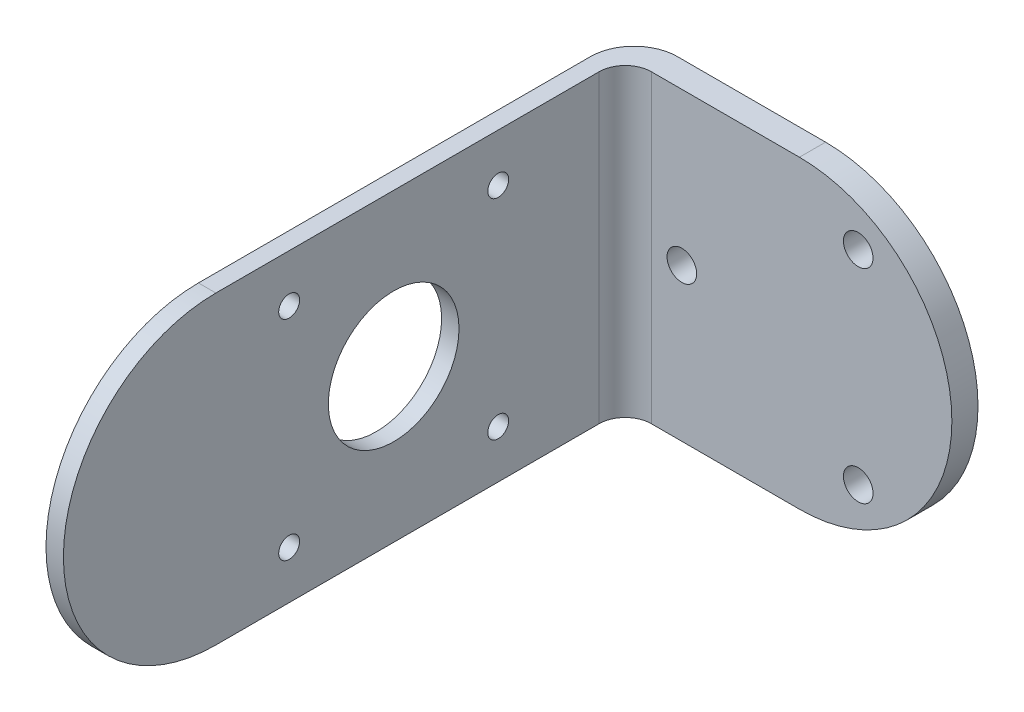
ISO-10303-21;
HEADER;
FILE_DESCRIPTION(('STEP AP214'),'2;1');
FILE_NAME('part.step','',(''),(''),'','','');
FILE_SCHEMA(('AUTOMOTIVE_DESIGN { 1 0 10303 214 1 1 1 1 }'));
ENDSEC;
DATA;
#1=APPLICATION_CONTEXT('core data for automotive mechanical design processes');
#2=APPLICATION_PROTOCOL_DEFINITION('international standard','automotive_design',2000,#1);
#3=PRODUCT_CONTEXT('',#1,'mechanical');
#4=PRODUCT('Part','Part','',(#3));
#5=PRODUCT_RELATED_PRODUCT_CATEGORY('part','',(#4));
#6=PRODUCT_DEFINITION_FORMATION('','',#4);
#7=PRODUCT_DEFINITION_CONTEXT('part definition',#1,'design');
#8=PRODUCT_DEFINITION('design','',#6,#7);
#9=PRODUCT_DEFINITION_SHAPE('','',#8);
#10=(LENGTH_UNIT() NAMED_UNIT(*) SI_UNIT(.MILLI.,.METRE.));
#11=(NAMED_UNIT(*) PLANE_ANGLE_UNIT() SI_UNIT($,.RADIAN.));
#12=(NAMED_UNIT(*) SI_UNIT($,.STERADIAN.) SOLID_ANGLE_UNIT());
#13=UNCERTAINTY_MEASURE_WITH_UNIT(LENGTH_MEASURE(1.E-05),#10,'distance_accuracy_value','');
#14=(GEOMETRIC_REPRESENTATION_CONTEXT(3) GLOBAL_UNCERTAINTY_ASSIGNED_CONTEXT((#13)) GLOBAL_UNIT_ASSIGNED_CONTEXT((#10,
#11,#12)) REPRESENTATION_CONTEXT('',''));
#15=CARTESIAN_POINT('',(0.,0.,0.));
#16=DIRECTION('',(0.,0.,1.));
#17=DIRECTION('',(1.,0.,0.));
#18=AXIS2_PLACEMENT_3D('',#15,#16,#17);
#19=CARTESIAN_POINT('',(0.,0.,3.));
#20=DIRECTION('',(0.,0.,1.));
#21=DIRECTION('',(1.,0.,0.));
#22=AXIS2_PLACEMENT_3D('',#19,#20,#21);
#23=PLANE('',#22);
#24=CARTESIAN_POINT('',(6.74999999999999,11.6913429510899,3.));
#25=DIRECTION('',(0.,0.,1.));
#26=DIRECTION('',(1.,0.,0.));
#27=AXIS2_PLACEMENT_3D('',#24,#25,#26);
#28=CIRCLE('',#27,1.7);
#29=CARTESIAN_POINT('',(8.44999999999999,11.6913429510899,3.));
#30=VERTEX_POINT('',#29);
#31=EDGE_CURVE('E165',#30,#30,#28,.T.);
#32=ORIENTED_EDGE('',*,*,#31,.F.);
#33=EDGE_LOOP('',(#32));
#34=FACE_BOUND('',#33,.T.);
#35=DIRECTION('',(-1.,0.,0.));
#36=VECTOR('',#35,1.);
#37=CARTESIAN_POINT('',(0.,17.5,3.));
#38=LINE('',#37,#36);
#39=CARTESIAN_POINT('',(0.,17.5,3.));
#40=VERTEX_POINT('',#39);
#41=CARTESIAN_POINT('',(-17.,17.5,3.));
#42=VERTEX_POINT('',#41);
#43=EDGE_CURVE('E185',#40,#42,#38,.T.);
#44=ORIENTED_EDGE('',*,*,#43,.T.);
#45=DIRECTION('',(0.,-1.,0.));
#46=VECTOR('',#45,1.);
#47=CARTESIAN_POINT('',(-17.,0.,3.));
#48=LINE('',#47,#46);
#49=CARTESIAN_POINT('',(-17.,-17.5,3.));
#50=VERTEX_POINT('',#49);
#51=EDGE_CURVE('E220',#42,#50,#48,.T.);
#52=ORIENTED_EDGE('',*,*,#51,.T.);
#53=DIRECTION('',(1.,0.,0.));
#54=VECTOR('',#53,1.);
#55=CARTESIAN_POINT('',(-20.,-17.5,3.));
#56=LINE('',#55,#54);
#57=CARTESIAN_POINT('',(0.,-17.5,3.));
#58=VERTEX_POINT('',#57);
#59=EDGE_CURVE('E189',#50,#58,#56,.T.);
#60=ORIENTED_EDGE('',*,*,#59,.T.);
#61=CARTESIAN_POINT('',(0.,0.,3.));
#62=DIRECTION('',(0.,0.,1.));
#63=DIRECTION('',(1.,0.,0.));
#64=AXIS2_PLACEMENT_3D('',#61,#62,#63);
#65=CIRCLE('',#64,17.5);
#66=EDGE_CURVE('E181',#58,#40,#65,.T.);
#67=ORIENTED_EDGE('',*,*,#66,.T.);
#68=EDGE_LOOP('',(#44,#52,#60,#67));
#69=FACE_BOUND('',#68,.T.);
#70=CARTESIAN_POINT('',(-13.5,0.,3.));
#71=DIRECTION('',(0.,0.,1.));
#72=DIRECTION('',(1.,0.,0.));
#73=AXIS2_PLACEMENT_3D('',#70,#71,#72);
#74=CIRCLE('',#73,1.7);
#75=CARTESIAN_POINT('',(-11.8,0.,3.));
#76=VERTEX_POINT('',#75);
#77=EDGE_CURVE('E173',#76,#76,#74,.T.);
#78=ORIENTED_EDGE('',*,*,#77,.F.);
#79=EDGE_LOOP('',(#78));
#80=FACE_BOUND('',#79,.T.);
#81=CARTESIAN_POINT('',(6.75000000000015,-11.6913429510898,3.));
#82=DIRECTION('',(0.,0.,1.));
#83=DIRECTION('',(1.,0.,0.));
#84=AXIS2_PLACEMENT_3D('',#81,#82,#83);
#85=CIRCLE('',#84,1.7);
#86=CARTESIAN_POINT('',(8.45000000000015,-11.6913429510898,3.));
#87=VERTEX_POINT('',#86);
#88=EDGE_CURVE('E157',#87,#87,#85,.T.);
#89=ORIENTED_EDGE('',*,*,#88,.F.);
#90=EDGE_LOOP('',(#89));
#91=FACE_BOUND('',#90,.T.);
#92=ADVANCED_FACE('F47',(#34,#69,#80,#91),#23,.T.);
#93=CARTESIAN_POINT('',(0.,0.,0.));
#94=DIRECTION('',(0.,0.,1.));
#95=DIRECTION('',(1.,0.,0.));
#96=AXIS2_PLACEMENT_3D('',#93,#94,#95);
#97=PLANE('',#96);
#98=DIRECTION('',(1.,0.,0.));
#99=VECTOR('',#98,1.);
#100=CARTESIAN_POINT('',(-20.,-17.5,0.));
#101=LINE('',#100,#99);
#102=CARTESIAN_POINT('',(-17.,-17.5,0.));
#103=VERTEX_POINT('',#102);
#104=CARTESIAN_POINT('',(0.,-17.5,0.));
#105=VERTEX_POINT('',#104);
#106=EDGE_CURVE('E186',#103,#105,#101,.T.);
#107=ORIENTED_EDGE('',*,*,#106,.F.);
#108=DIRECTION('',(0.,-1.,0.));
#109=VECTOR('',#108,1.);
#110=CARTESIAN_POINT('',(-17.,17.5,0.));
#111=LINE('',#110,#109);
#112=CARTESIAN_POINT('',(-17.,17.5,0.));
#113=VERTEX_POINT('',#112);
#114=EDGE_CURVE('E214',#103,#113,#111,.F.);
#115=ORIENTED_EDGE('',*,*,#114,.T.);
#116=DIRECTION('',(-1.,0.,0.));
#117=VECTOR('',#116,1.);
#118=CARTESIAN_POINT('',(0.,17.5,0.));
#119=LINE('',#118,#117);
#120=CARTESIAN_POINT('',(0.,17.5,0.));
#121=VERTEX_POINT('',#120);
#122=EDGE_CURVE('E196',#121,#113,#119,.T.);
#123=ORIENTED_EDGE('',*,*,#122,.F.);
#124=CARTESIAN_POINT('',(0.,0.,0.));
#125=DIRECTION('',(0.,0.,1.));
#126=DIRECTION('',(1.,0.,0.));
#127=AXIS2_PLACEMENT_3D('',#124,#125,#126);
#128=CIRCLE('',#127,17.5);
#129=EDGE_CURVE('E177',#105,#121,#128,.T.);
#130=ORIENTED_EDGE('',*,*,#129,.F.);
#131=EDGE_LOOP('',(#107,#115,#123,#130));
#132=FACE_BOUND('',#131,.T.);
#133=CARTESIAN_POINT('',(-13.5,0.,0.));
#134=DIRECTION('',(0.,0.,1.));
#135=DIRECTION('',(1.,0.,0.));
#136=AXIS2_PLACEMENT_3D('',#133,#134,#135);
#137=CIRCLE('',#136,1.7);
#138=CARTESIAN_POINT('',(-11.8,0.,0.));
#139=VERTEX_POINT('',#138);
#140=EDGE_CURVE('E169',#139,#139,#137,.T.);
#141=ORIENTED_EDGE('',*,*,#140,.T.);
#142=EDGE_LOOP('',(#141));
#143=FACE_BOUND('',#142,.T.);
#144=CARTESIAN_POINT('',(6.74999999999999,11.6913429510899,0.));
#145=DIRECTION('',(0.,0.,1.));
#146=DIRECTION('',(1.,0.,0.));
#147=AXIS2_PLACEMENT_3D('',#144,#145,#146);
#148=CIRCLE('',#147,1.7);
#149=CARTESIAN_POINT('',(8.44999999999999,11.6913429510899,0.));
#150=VERTEX_POINT('',#149);
#151=EDGE_CURVE('E161',#150,#150,#148,.T.);
#152=ORIENTED_EDGE('',*,*,#151,.T.);
#153=EDGE_LOOP('',(#152));
#154=FACE_BOUND('',#153,.T.);
#155=CARTESIAN_POINT('',(6.75000000000015,-11.6913429510898,0.));
#156=DIRECTION('',(0.,0.,1.));
#157=DIRECTION('',(1.,0.,0.));
#158=AXIS2_PLACEMENT_3D('',#155,#156,#157);
#159=CIRCLE('',#158,1.7);
#160=CARTESIAN_POINT('',(8.45000000000015,-11.6913429510898,0.));
#161=VERTEX_POINT('',#160);
#162=EDGE_CURVE('E133',#161,#161,#159,.T.);
#163=ORIENTED_EDGE('',*,*,#162,.T.);
#164=EDGE_LOOP('',(#163));
#165=FACE_BOUND('',#164,.T.);
#166=ADVANCED_FACE('F242',(#132,#143,#154,#165),#97,.F.);
#167=CARTESIAN_POINT('',(0.,0.,3.));
#168=DIRECTION('',(0.,0.,-1.));
#169=DIRECTION('',(-1.,0.,0.));
#170=AXIS2_PLACEMENT_3D('',#167,#168,#169);
#171=CYLINDRICAL_SURFACE('',#170,17.5);
#172=ORIENTED_EDGE('',*,*,#129,.T.);
#173=DIRECTION('',(0.,0.,-1.));
#174=VECTOR('',#173,1.);
#175=CARTESIAN_POINT('',(0.,17.5,3.));
#176=LINE('',#175,#174);
#177=EDGE_CURVE('E205',#40,#121,#176,.T.);
#178=ORIENTED_EDGE('',*,*,#177,.F.);
#179=ORIENTED_EDGE('',*,*,#66,.F.);
#180=DIRECTION('',(0.,0.,-1.));
#181=VECTOR('',#180,1.);
#182=CARTESIAN_POINT('',(0.,-17.5,3.));
#183=LINE('',#182,#181);
#184=EDGE_CURVE('E192',#58,#105,#183,.T.);
#185=ORIENTED_EDGE('',*,*,#184,.T.);
#186=EDGE_LOOP('',(#172,#178,#179,#185));
#187=FACE_BOUND('',#186,.T.);
#188=ADVANCED_FACE('F239',(#187),#171,.T.);
#189=CARTESIAN_POINT('',(0.,17.5,3.));
#190=DIRECTION('',(0.,-1.,0.));
#191=DIRECTION('',(0.,0.,-1.));
#192=AXIS2_PLACEMENT_3D('',#189,#190,#191);
#193=PLANE('',#192);
#194=ORIENTED_EDGE('',*,*,#122,.T.);
#195=CARTESIAN_POINT('',(-17.,17.5,5.));
#196=DIRECTION('',(0.,-1.,0.));
#197=DIRECTION('',(0.,0.,-1.));
#198=AXIS2_PLACEMENT_3D('',#195,#196,#197);
#199=CIRCLE('',#198,5.);
#200=CARTESIAN_POINT('',(-22.,17.5,5.));
#201=VERTEX_POINT('',#200);
#202=EDGE_CURVE('E217',#113,#201,#199,.F.);
#203=ORIENTED_EDGE('',*,*,#202,.T.);
#204=DIRECTION('',(0.,0.,-1.));
#205=VECTOR('',#204,1.);
#206=CARTESIAN_POINT('',(-22.,17.5,0.));
#207=LINE('',#206,#205);
#208=CARTESIAN_POINT('',(-22.,17.5,50.));
#209=VERTEX_POINT('',#208);
#210=EDGE_CURVE('E140',#209,#201,#207,.T.);
#211=ORIENTED_EDGE('',*,*,#210,.F.);
#212=DIRECTION('',(1.,0.,0.));
#213=VECTOR('',#212,1.);
#214=CARTESIAN_POINT('',(-22.,17.5,50.));
#215=LINE('',#214,#213);
#216=CARTESIAN_POINT('',(-20.,17.5,50.));
#217=VERTEX_POINT('',#216);
#218=EDGE_CURVE('E134',#209,#217,#215,.T.);
#219=ORIENTED_EDGE('',*,*,#218,.T.);
#220=DIRECTION('',(0.,0.,-1.));
#221=VECTOR('',#220,1.);
#222=CARTESIAN_POINT('',(-20.,17.5,0.));
#223=LINE('',#222,#221);
#224=CARTESIAN_POINT('',(-20.,17.5,6.));
#225=VERTEX_POINT('',#224);
#226=EDGE_CURVE('E124',#217,#225,#223,.T.);
#227=ORIENTED_EDGE('',*,*,#226,.T.);
#228=CARTESIAN_POINT('',(-17.,17.5,6.));
#229=DIRECTION('',(0.,-1.,0.));
#230=DIRECTION('',(0.,0.,-1.));
#231=AXIS2_PLACEMENT_3D('',#228,#229,#230);
#232=CIRCLE('',#231,3.);
#233=EDGE_CURVE('E12',#225,#42,#232,.T.);
#234=ORIENTED_EDGE('',*,*,#233,.T.);
#235=ORIENTED_EDGE('',*,*,#43,.F.);
#236=ORIENTED_EDGE('',*,*,#177,.T.);
#237=EDGE_LOOP('',(#194,#203,#211,#219,#227,#234,#235,#236));
#238=FACE_BOUND('',#237,.T.);
#239=ADVANCED_FACE('F235',(#238),#193,.F.);
#240=CARTESIAN_POINT('',(-20.,-17.5,3.));
#241=DIRECTION('',(0.,1.,0.));
#242=DIRECTION('',(0.,0.,1.));
#243=AXIS2_PLACEMENT_3D('',#240,#241,#242);
#244=PLANE('',#243);
#245=DIRECTION('',(0.,0.,1.));
#246=VECTOR('',#245,1.);
#247=CARTESIAN_POINT('',(-22.,-17.5,0.));
#248=LINE('',#247,#246);
#249=CARTESIAN_POINT('',(-22.,-17.5,5.));
#250=VERTEX_POINT('',#249);
#251=CARTESIAN_POINT('',(-22.,-17.5,50.));
#252=VERTEX_POINT('',#251);
#253=EDGE_CURVE('E113',#250,#252,#248,.T.);
#254=ORIENTED_EDGE('',*,*,#253,.F.);
#255=CARTESIAN_POINT('',(-17.,-17.5,5.));
#256=DIRECTION('',(0.,1.,0.));
#257=DIRECTION('',(0.,0.,1.));
#258=AXIS2_PLACEMENT_3D('',#255,#256,#257);
#259=CIRCLE('',#258,5.);
#260=EDGE_CURVE('E211',#250,#103,#259,.F.);
#261=ORIENTED_EDGE('',*,*,#260,.T.);
#262=ORIENTED_EDGE('',*,*,#106,.T.);
#263=ORIENTED_EDGE('',*,*,#184,.F.);
#264=ORIENTED_EDGE('',*,*,#59,.F.);
#265=CARTESIAN_POINT('',(-17.,-17.5,6.));
#266=DIRECTION('',(0.,1.,0.));
#267=DIRECTION('',(0.,0.,1.));
#268=AXIS2_PLACEMENT_3D('',#265,#266,#267);
#269=CIRCLE('',#268,3.);
#270=CARTESIAN_POINT('',(-20.,-17.5,6.));
#271=VERTEX_POINT('',#270);
#272=EDGE_CURVE('E56',#50,#271,#269,.T.);
#273=ORIENTED_EDGE('',*,*,#272,.T.);
#274=DIRECTION('',(0.,0.,1.));
#275=VECTOR('',#274,1.);
#276=CARTESIAN_POINT('',(-20.,-17.5,0.));
#277=LINE('',#276,#275);
#278=CARTESIAN_POINT('',(-20.,-17.5,50.));
#279=VERTEX_POINT('',#278);
#280=EDGE_CURVE('E129',#271,#279,#277,.T.);
#281=ORIENTED_EDGE('',*,*,#280,.T.);
#282=DIRECTION('',(1.,0.,0.));
#283=VECTOR('',#282,1.);
#284=CARTESIAN_POINT('',(-22.,-17.5,50.));
#285=LINE('',#284,#283);
#286=EDGE_CURVE('E127',#252,#279,#285,.T.);
#287=ORIENTED_EDGE('',*,*,#286,.F.);
#288=EDGE_LOOP('',(#254,#261,#262,#263,#264,#273,#281,#287));
#289=FACE_BOUND('',#288,.T.);
#290=ADVANCED_FACE('F128',(#289),#244,.F.);
#291=CARTESIAN_POINT('',(-13.5,0.,3.));
#292=DIRECTION('',(0.,0.,-1.));
#293=DIRECTION('',(-1.,0.,0.));
#294=AXIS2_PLACEMENT_3D('',#291,#292,#293);
#295=CYLINDRICAL_SURFACE('',#294,1.7);
#296=ORIENTED_EDGE('',*,*,#77,.T.);
#297=EDGE_LOOP('',(#296));
#298=FACE_BOUND('',#297,.T.);
#299=ORIENTED_EDGE('',*,*,#140,.F.);
#300=EDGE_LOOP('',(#299));
#301=FACE_BOUND('',#300,.T.);
#302=ADVANCED_FACE('F263',(#298,#301),#295,.F.);
#303=CARTESIAN_POINT('',(6.74999999999999,11.6913429510899,3.));
#304=DIRECTION('',(0.,0.,-1.));
#305=DIRECTION('',(-1.,0.,0.));
#306=AXIS2_PLACEMENT_3D('',#303,#304,#305);
#307=CYLINDRICAL_SURFACE('',#306,1.7);
#308=ORIENTED_EDGE('',*,*,#31,.T.);
#309=EDGE_LOOP('',(#308));
#310=FACE_BOUND('',#309,.T.);
#311=ORIENTED_EDGE('',*,*,#151,.F.);
#312=EDGE_LOOP('',(#311));
#313=FACE_BOUND('',#312,.T.);
#314=ADVANCED_FACE('F283',(#310,#313),#307,.F.);
#315=CARTESIAN_POINT('',(6.75000000000015,-11.6913429510898,3.));
#316=DIRECTION('',(0.,0.,-1.));
#317=DIRECTION('',(-1.,0.,0.));
#318=AXIS2_PLACEMENT_3D('',#315,#316,#317);
#319=CYLINDRICAL_SURFACE('',#318,1.7);
#320=ORIENTED_EDGE('',*,*,#88,.T.);
#321=EDGE_LOOP('',(#320));
#322=FACE_BOUND('',#321,.T.);
#323=ORIENTED_EDGE('',*,*,#162,.F.);
#324=EDGE_LOOP('',(#323));
#325=FACE_BOUND('',#324,.T.);
#326=ADVANCED_FACE('F289',(#322,#325),#319,.F.);
#327=CARTESIAN_POINT('',(-22.,0.,50.));
#328=DIRECTION('',(1.,0.,0.));
#329=DIRECTION('',(0.,0.,-1.));
#330=AXIS2_PLACEMENT_3D('',#327,#328,#329);
#331=CYLINDRICAL_SURFACE('',#330,17.5);
#332=CARTESIAN_POINT('',(-20.,0.,50.));
#333=DIRECTION('',(-1.,0.,0.));
#334=DIRECTION('',(0.,0.,1.));
#335=AXIS2_PLACEMENT_3D('',#332,#333,#334);
#336=CIRCLE('',#335,17.5);
#337=EDGE_CURVE('E150',#279,#217,#336,.T.);
#338=ORIENTED_EDGE('',*,*,#337,.T.);
#339=ORIENTED_EDGE('',*,*,#218,.F.);
#340=CARTESIAN_POINT('',(-22.,0.,50.));
#341=DIRECTION('',(-1.,0.,0.));
#342=DIRECTION('',(0.,0.,1.));
#343=AXIS2_PLACEMENT_3D('',#340,#341,#342);
#344=CIRCLE('',#343,17.5);
#345=EDGE_CURVE('E118',#252,#209,#344,.T.);
#346=ORIENTED_EDGE('',*,*,#345,.F.);
#347=ORIENTED_EDGE('',*,*,#286,.T.);
#348=EDGE_LOOP('',(#338,#339,#346,#347));
#349=FACE_BOUND('',#348,.T.);
#350=ADVANCED_FACE('F136',(#349),#331,.T.);
#351=CARTESIAN_POINT('',(-22.,0.,50.));
#352=DIRECTION('',(-1.,0.,0.));
#353=DIRECTION('',(0.,0.,1.));
#354=AXIS2_PLACEMENT_3D('',#351,#352,#353);
#355=PLANE('',#354);
#356=CARTESIAN_POINT('',(-22.,12.,41.583465403301));
#357=DIRECTION('',(-1.,0.,0.));
#358=DIRECTION('',(0.,0.,1.));
#359=AXIS2_PLACEMENT_3D('',#356,#357,#358);
#360=CIRCLE('',#359,1.2);
#361=CARTESIAN_POINT('',(-22.,12.,42.783465403301));
#362=VERTEX_POINT('',#361);
#363=EDGE_CURVE('E151',#362,#362,#360,.T.);
#364=ORIENTED_EDGE('',*,*,#363,.F.);
#365=EDGE_LOOP('',(#364));
#366=FACE_BOUND('',#365,.T.);
#367=CARTESIAN_POINT('',(-22.,12.,17.583465403301));
#368=DIRECTION('',(-1.,0.,0.));
#369=DIRECTION('',(0.,0.,1.));
#370=AXIS2_PLACEMENT_3D('',#367,#368,#369);
#371=CIRCLE('',#370,1.2);
#372=CARTESIAN_POINT('',(-22.,12.,18.783465403301));
#373=VERTEX_POINT('',#372);
#374=EDGE_CURVE('E468',#373,#373,#371,.T.);
#375=ORIENTED_EDGE('',*,*,#374,.F.);
#376=EDGE_LOOP('',(#375));
#377=FACE_BOUND('',#376,.T.);
#378=CARTESIAN_POINT('',(-22.,-12.,17.583465403301));
#379=DIRECTION('',(-1.,0.,0.));
#380=DIRECTION('',(0.,0.,1.));
#381=AXIS2_PLACEMENT_3D('',#378,#379,#380);
#382=CIRCLE('',#381,1.2);
#383=CARTESIAN_POINT('',(-22.,-12.,18.783465403301));
#384=VERTEX_POINT('',#383);
#385=EDGE_CURVE('E464',#384,#384,#382,.T.);
#386=ORIENTED_EDGE('',*,*,#385,.F.);
#387=EDGE_LOOP('',(#386));
#388=FACE_BOUND('',#387,.T.);
#389=CARTESIAN_POINT('',(-22.,-12.,41.583465403301));
#390=DIRECTION('',(-1.,0.,0.));
#391=DIRECTION('',(0.,0.,1.));
#392=AXIS2_PLACEMENT_3D('',#389,#390,#391);
#393=CIRCLE('',#392,1.2);
#394=CARTESIAN_POINT('',(-22.,-12.,42.783465403301));
#395=VERTEX_POINT('',#394);
#396=EDGE_CURVE('E460',#395,#395,#393,.T.);
#397=ORIENTED_EDGE('',*,*,#396,.F.);
#398=EDGE_LOOP('',(#397));
#399=FACE_BOUND('',#398,.T.);
#400=CARTESIAN_POINT('',(-22.,0.,29.583465403301));
#401=DIRECTION('',(-1.,0.,0.));
#402=DIRECTION('',(0.,0.,1.));
#403=AXIS2_PLACEMENT_3D('',#400,#401,#402);
#404=CIRCLE('',#403,7.5);
#405=CARTESIAN_POINT('',(-22.,0.,37.083465403301));
#406=VERTEX_POINT('',#405);
#407=EDGE_CURVE('E455',#406,#406,#404,.T.);
#408=ORIENTED_EDGE('',*,*,#407,.F.);
#409=EDGE_LOOP('',(#408));
#410=FACE_BOUND('',#409,.T.);
#411=ORIENTED_EDGE('',*,*,#210,.T.);
#412=DIRECTION('',(0.,-1.,0.));
#413=VECTOR('',#412,1.);
#414=CARTESIAN_POINT('',(-22.,-17.5,5.));
#415=LINE('',#414,#413);
#416=EDGE_CURVE('E121',#201,#250,#415,.T.);
#417=ORIENTED_EDGE('',*,*,#416,.T.);
#418=ORIENTED_EDGE('',*,*,#253,.T.);
#419=ORIENTED_EDGE('',*,*,#345,.T.);
#420=EDGE_LOOP('',(#411,#417,#418,#419));
#421=FACE_BOUND('',#420,.T.);
#422=ADVANCED_FACE('F116',(#366,#377,#388,#399,#410,#421),#355,.T.);
#423=CARTESIAN_POINT('',(-20.,0.,50.));
#424=DIRECTION('',(-1.,0.,0.));
#425=DIRECTION('',(0.,0.,1.));
#426=AXIS2_PLACEMENT_3D('',#423,#424,#425);
#427=PLANE('',#426);
#428=CARTESIAN_POINT('',(-20.,12.,41.583465403301));
#429=DIRECTION('',(1.,0.,0.));
#430=DIRECTION('',(0.,0.,-1.));
#431=AXIS2_PLACEMENT_3D('',#428,#429,#430);
#432=CIRCLE('',#431,1.2);
#433=CARTESIAN_POINT('',(-20.,12.,40.383465403301));
#434=VERTEX_POINT('',#433);
#435=EDGE_CURVE('E441',#434,#434,#432,.T.);
#436=ORIENTED_EDGE('',*,*,#435,.F.);
#437=EDGE_LOOP('',(#436));
#438=FACE_BOUND('',#437,.T.);
#439=CARTESIAN_POINT('',(-20.,12.,17.583465403301));
#440=DIRECTION('',(1.,0.,0.));
#441=DIRECTION('',(0.,0.,-1.));
#442=AXIS2_PLACEMENT_3D('',#439,#440,#441);
#443=CIRCLE('',#442,1.2);
#444=CARTESIAN_POINT('',(-20.,12.,16.383465403301));
#445=VERTEX_POINT('',#444);
#446=EDGE_CURVE('E443',#445,#445,#443,.T.);
#447=ORIENTED_EDGE('',*,*,#446,.F.);
#448=EDGE_LOOP('',(#447));
#449=FACE_BOUND('',#448,.T.);
#450=CARTESIAN_POINT('',(-20.,-12.,17.583465403301));
#451=DIRECTION('',(1.,0.,0.));
#452=DIRECTION('',(0.,0.,-1.));
#453=AXIS2_PLACEMENT_3D('',#450,#451,#452);
#454=CIRCLE('',#453,1.2);
#455=CARTESIAN_POINT('',(-20.,-12.,16.383465403301));
#456=VERTEX_POINT('',#455);
#457=EDGE_CURVE('E447',#456,#456,#454,.T.);
#458=ORIENTED_EDGE('',*,*,#457,.F.);
#459=EDGE_LOOP('',(#458));
#460=FACE_BOUND('',#459,.T.);
#461=CARTESIAN_POINT('',(-20.,-12.,41.583465403301));
#462=DIRECTION('',(1.,0.,0.));
#463=DIRECTION('',(0.,0.,-1.));
#464=AXIS2_PLACEMENT_3D('',#461,#462,#463);
#465=CIRCLE('',#464,1.2);
#466=CARTESIAN_POINT('',(-20.,-12.,40.383465403301));
#467=VERTEX_POINT('',#466);
#468=EDGE_CURVE('E456',#467,#467,#465,.T.);
#469=ORIENTED_EDGE('',*,*,#468,.F.);
#470=EDGE_LOOP('',(#469));
#471=FACE_BOUND('',#470,.T.);
#472=CARTESIAN_POINT('',(-20.,0.,29.583465403301));
#473=DIRECTION('',(1.,0.,0.));
#474=DIRECTION('',(0.,0.,-1.));
#475=AXIS2_PLACEMENT_3D('',#472,#473,#474);
#476=CIRCLE('',#475,7.5);
#477=CARTESIAN_POINT('',(-20.,0.,22.083465403301));
#478=VERTEX_POINT('',#477);
#479=EDGE_CURVE('E451',#478,#478,#476,.T.);
#480=ORIENTED_EDGE('',*,*,#479,.F.);
#481=EDGE_LOOP('',(#480));
#482=FACE_BOUND('',#481,.T.);
#483=ORIENTED_EDGE('',*,*,#280,.F.);
#484=DIRECTION('',(0.,-1.,0.));
#485=VECTOR('',#484,1.);
#486=CARTESIAN_POINT('',(-20.,0.,6.));
#487=LINE('',#486,#485);
#488=EDGE_CURVE('E69',#271,#225,#487,.F.);
#489=ORIENTED_EDGE('',*,*,#488,.T.);
#490=ORIENTED_EDGE('',*,*,#226,.F.);
#491=ORIENTED_EDGE('',*,*,#337,.F.);
#492=EDGE_LOOP('',(#483,#489,#490,#491));
#493=FACE_BOUND('',#492,.T.);
#494=ADVANCED_FACE('F230',(#438,#449,#460,#471,#482,#493),#427,.F.);
#495=CARTESIAN_POINT('',(-17.,0.,5.));
#496=DIRECTION('',(0.,1.,0.));
#497=DIRECTION('',(0.,0.,1.));
#498=AXIS2_PLACEMENT_3D('',#495,#496,#497);
#499=CYLINDRICAL_SURFACE('',#498,5.);
#500=ORIENTED_EDGE('',*,*,#202,.F.);
#501=ORIENTED_EDGE('',*,*,#114,.F.);
#502=ORIENTED_EDGE('',*,*,#260,.F.);
#503=ORIENTED_EDGE('',*,*,#416,.F.);
#504=EDGE_LOOP('',(#500,#501,#502,#503));
#505=FACE_BOUND('',#504,.T.);
#506=ADVANCED_FACE('F246',(#505),#499,.T.);
#507=CARTESIAN_POINT('',(-17.,0.,6.));
#508=DIRECTION('',(0.,-1.,0.));
#509=DIRECTION('',(0.,0.,-1.));
#510=AXIS2_PLACEMENT_3D('',#507,#508,#509);
#511=CYLINDRICAL_SURFACE('',#510,3.);
#512=ORIENTED_EDGE('',*,*,#233,.F.);
#513=ORIENTED_EDGE('',*,*,#488,.F.);
#514=ORIENTED_EDGE('',*,*,#272,.F.);
#515=ORIENTED_EDGE('',*,*,#51,.F.);
#516=EDGE_LOOP('',(#512,#513,#514,#515));
#517=FACE_BOUND('',#516,.T.);
#518=ADVANCED_FACE('F49',(#517),#511,.F.);
#519=CARTESIAN_POINT('',(-23.,0.,29.583465403301));
#520=DIRECTION('',(1.,0.,0.));
#521=DIRECTION('',(0.,0.,-1.));
#522=AXIS2_PLACEMENT_3D('',#519,#520,#521);
#523=CYLINDRICAL_SURFACE('',#522,7.5);
#524=ORIENTED_EDGE('',*,*,#407,.T.);
#525=EDGE_LOOP('',(#524));
#526=FACE_BOUND('',#525,.T.);
#527=ORIENTED_EDGE('',*,*,#479,.T.);
#528=EDGE_LOOP('',(#527));
#529=FACE_BOUND('',#528,.T.);
#530=ADVANCED_FACE('F251',(#526,#529),#523,.F.);
#531=CARTESIAN_POINT('',(-23.,-12.,41.583465403301));
#532=DIRECTION('',(1.,0.,0.));
#533=DIRECTION('',(0.,0.,-1.));
#534=AXIS2_PLACEMENT_3D('',#531,#532,#533);
#535=CYLINDRICAL_SURFACE('',#534,1.2);
#536=ORIENTED_EDGE('',*,*,#396,.T.);
#537=EDGE_LOOP('',(#536));
#538=FACE_BOUND('',#537,.T.);
#539=ORIENTED_EDGE('',*,*,#468,.T.);
#540=EDGE_LOOP('',(#539));
#541=FACE_BOUND('',#540,.T.);
#542=ADVANCED_FACE('F322',(#538,#541),#535,.F.);
#543=CARTESIAN_POINT('',(-23.,-12.,17.583465403301));
#544=DIRECTION('',(1.,0.,0.));
#545=DIRECTION('',(0.,0.,-1.));
#546=AXIS2_PLACEMENT_3D('',#543,#544,#545);
#547=CYLINDRICAL_SURFACE('',#546,1.2);
#548=ORIENTED_EDGE('',*,*,#385,.T.);
#549=EDGE_LOOP('',(#548));
#550=FACE_BOUND('',#549,.T.);
#551=ORIENTED_EDGE('',*,*,#457,.T.);
#552=EDGE_LOOP('',(#551));
#553=FACE_BOUND('',#552,.T.);
#554=ADVANCED_FACE('F333',(#550,#553),#547,.F.);
#555=CARTESIAN_POINT('',(-23.,12.,17.583465403301));
#556=DIRECTION('',(1.,0.,0.));
#557=DIRECTION('',(0.,0.,-1.));
#558=AXIS2_PLACEMENT_3D('',#555,#556,#557);
#559=CYLINDRICAL_SURFACE('',#558,1.2);
#560=ORIENTED_EDGE('',*,*,#374,.T.);
#561=EDGE_LOOP('',(#560));
#562=FACE_BOUND('',#561,.T.);
#563=ORIENTED_EDGE('',*,*,#446,.T.);
#564=EDGE_LOOP('',(#563));
#565=FACE_BOUND('',#564,.T.);
#566=ADVANCED_FACE('F343',(#562,#565),#559,.F.);
#567=CARTESIAN_POINT('',(-23.,12.,41.583465403301));
#568=DIRECTION('',(1.,0.,0.));
#569=DIRECTION('',(0.,0.,-1.));
#570=AXIS2_PLACEMENT_3D('',#567,#568,#569);
#571=CYLINDRICAL_SURFACE('',#570,1.2);
#572=ORIENTED_EDGE('',*,*,#363,.T.);
#573=EDGE_LOOP('',(#572));
#574=FACE_BOUND('',#573,.T.);
#575=ORIENTED_EDGE('',*,*,#435,.T.);
#576=EDGE_LOOP('',(#575));
#577=FACE_BOUND('',#576,.T.);
#578=ADVANCED_FACE('F353',(#574,#577),#571,.F.);
#579=CLOSED_SHELL('',(#92,#166,#188,#239,#290,#302,#314,#326,#350,#422,#494,#506,#518,#530,#542,
#554,#566,#578));
#580=MANIFOLD_SOLID_BREP('B2',#579);
#581=ADVANCED_BREP_SHAPE_REPRESENTATION('',(#18,#580),#14);
#582=SHAPE_DEFINITION_REPRESENTATION(#9,#581);
ENDSEC;
END-ISO-10303-21;
